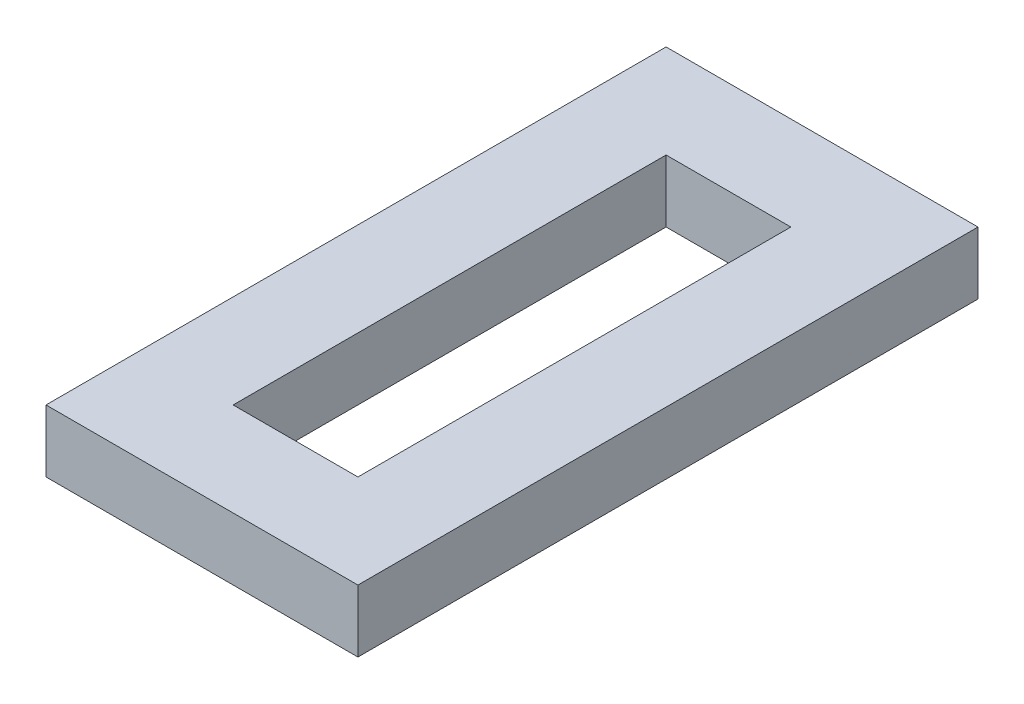
ISO-10303-21;
HEADER;
FILE_DESCRIPTION(('STEP AP214'),'2;1');
FILE_NAME('part.step','',(''),(''),'','','');
FILE_SCHEMA(('AUTOMOTIVE_DESIGN { 1 0 10303 214 1 1 1 1 }'));
ENDSEC;
DATA;
#1=APPLICATION_CONTEXT('core data for automotive mechanical design processes');
#2=APPLICATION_PROTOCOL_DEFINITION('international standard','automotive_design',2000,#1);
#3=PRODUCT_CONTEXT('',#1,'mechanical');
#4=PRODUCT('Part','Part','',(#3));
#5=PRODUCT_RELATED_PRODUCT_CATEGORY('part','',(#4));
#6=PRODUCT_DEFINITION_FORMATION('','',#4);
#7=PRODUCT_DEFINITION_CONTEXT('part definition',#1,'design');
#8=PRODUCT_DEFINITION('design','',#6,#7);
#9=PRODUCT_DEFINITION_SHAPE('','',#8);
#10=(LENGTH_UNIT() NAMED_UNIT(*) SI_UNIT(.MILLI.,.METRE.));
#11=(NAMED_UNIT(*) PLANE_ANGLE_UNIT() SI_UNIT($,.RADIAN.));
#12=(NAMED_UNIT(*) SI_UNIT($,.STERADIAN.) SOLID_ANGLE_UNIT());
#13=UNCERTAINTY_MEASURE_WITH_UNIT(LENGTH_MEASURE(1.E-05),#10,'distance_accuracy_value','');
#14=(GEOMETRIC_REPRESENTATION_CONTEXT(3) GLOBAL_UNCERTAINTY_ASSIGNED_CONTEXT((#13)) GLOBAL_UNIT_ASSIGNED_CONTEXT((#10,
#11,#12)) REPRESENTATION_CONTEXT('',''));
#15=CARTESIAN_POINT('',(0.,0.,0.));
#16=DIRECTION('',(0.,0.,1.));
#17=DIRECTION('',(1.,0.,0.));
#18=AXIS2_PLACEMENT_3D('',#15,#16,#17);
#19=CARTESIAN_POINT('',(25.,-10.,49.7));
#20=DIRECTION('',(1.,0.,0.));
#21=DIRECTION('',(0.,0.,-1.));
#22=AXIS2_PLACEMENT_3D('',#19,#20,#21);
#23=PLANE('',#22);
#24=DIRECTION('',(0.,0.,-1.));
#25=VECTOR('',#24,1.);
#26=CARTESIAN_POINT('',(25.,0.,49.7));
#27=LINE('',#26,#25);
#28=CARTESIAN_POINT('',(25.,0.,49.7));
#29=VERTEX_POINT('',#28);
#30=CARTESIAN_POINT('',(25.,0.,-49.7));
#31=VERTEX_POINT('',#30);
#32=EDGE_CURVE('E154',#29,#31,#27,.T.);
#33=ORIENTED_EDGE('',*,*,#32,.F.);
#34=DIRECTION('',(0.,1.,0.));
#35=VECTOR('',#34,1.);
#36=CARTESIAN_POINT('',(25.,-10.,49.7));
#37=LINE('',#36,#35);
#38=CARTESIAN_POINT('',(25.,-10.,49.7));
#39=VERTEX_POINT('',#38);
#40=EDGE_CURVE('E11',#39,#29,#37,.T.);
#41=ORIENTED_EDGE('',*,*,#40,.F.);
#42=DIRECTION('',(0.,0.,-1.));
#43=VECTOR('',#42,1.);
#44=CARTESIAN_POINT('',(25.,-10.,49.7));
#45=LINE('',#44,#43);
#46=CARTESIAN_POINT('',(25.,-10.,-49.7));
#47=VERTEX_POINT('',#46);
#48=EDGE_CURVE('E160',#39,#47,#45,.T.);
#49=ORIENTED_EDGE('',*,*,#48,.T.);
#50=DIRECTION('',(0.,1.,0.));
#51=VECTOR('',#50,1.);
#52=CARTESIAN_POINT('',(25.,-10.,-49.7));
#53=LINE('',#52,#51);
#54=EDGE_CURVE('E48',#47,#31,#53,.T.);
#55=ORIENTED_EDGE('',*,*,#54,.T.);
#56=EDGE_LOOP('',(#33,#41,#49,#55));
#57=FACE_BOUND('',#56,.T.);
#58=ADVANCED_FACE('F45',(#57),#23,.T.);
#59=CARTESIAN_POINT('',(-25.,-10.,49.7));
#60=DIRECTION('',(0.,0.,1.));
#61=DIRECTION('',(1.,0.,0.));
#62=AXIS2_PLACEMENT_3D('',#59,#60,#61);
#63=PLANE('',#62);
#64=DIRECTION('',(1.,0.,0.));
#65=VECTOR('',#64,1.);
#66=CARTESIAN_POINT('',(-25.,0.,49.7));
#67=LINE('',#66,#65);
#68=CARTESIAN_POINT('',(-25.,0.,49.7));
#69=VERTEX_POINT('',#68);
#70=EDGE_CURVE('E165',#69,#29,#67,.T.);
#71=ORIENTED_EDGE('',*,*,#70,.F.);
#72=DIRECTION('',(0.,1.,0.));
#73=VECTOR('',#72,1.);
#74=CARTESIAN_POINT('',(-25.,-10.,49.7));
#75=LINE('',#74,#73);
#76=CARTESIAN_POINT('',(-25.,-10.,49.7));
#77=VERTEX_POINT('',#76);
#78=EDGE_CURVE('E54',#77,#69,#75,.T.);
#79=ORIENTED_EDGE('',*,*,#78,.F.);
#80=DIRECTION('',(1.,0.,0.));
#81=VECTOR('',#80,1.);
#82=CARTESIAN_POINT('',(-25.,-10.,49.7));
#83=LINE('',#82,#81);
#84=EDGE_CURVE('E173',#77,#39,#83,.T.);
#85=ORIENTED_EDGE('',*,*,#84,.T.);
#86=ORIENTED_EDGE('',*,*,#40,.T.);
#87=EDGE_LOOP('',(#71,#79,#85,#86));
#88=FACE_BOUND('',#87,.T.);
#89=ADVANCED_FACE('F207',(#88),#63,.T.);
#90=CARTESIAN_POINT('',(-25.,-10.,49.7));
#91=DIRECTION('',(-1.,0.,0.));
#92=DIRECTION('',(0.,0.,1.));
#93=AXIS2_PLACEMENT_3D('',#90,#91,#92);
#94=PLANE('',#93);
#95=DIRECTION('',(0.,0.,1.));
#96=VECTOR('',#95,1.);
#97=CARTESIAN_POINT('',(-25.,0.,49.7));
#98=LINE('',#97,#96);
#99=CARTESIAN_POINT('',(-25.,0.,-49.7));
#100=VERTEX_POINT('',#99);
#101=EDGE_CURVE('E184',#100,#69,#98,.T.);
#102=ORIENTED_EDGE('',*,*,#101,.F.);
#103=DIRECTION('',(0.,1.,0.));
#104=VECTOR('',#103,1.);
#105=CARTESIAN_POINT('',(-25.,-10.,-49.7));
#106=LINE('',#105,#104);
#107=CARTESIAN_POINT('',(-25.,-10.,-49.7));
#108=VERTEX_POINT('',#107);
#109=EDGE_CURVE('E192',#108,#100,#106,.T.);
#110=ORIENTED_EDGE('',*,*,#109,.F.);
#111=DIRECTION('',(0.,0.,1.));
#112=VECTOR('',#111,1.);
#113=CARTESIAN_POINT('',(-25.,-10.,49.7));
#114=LINE('',#113,#112);
#115=EDGE_CURVE('E169',#108,#77,#114,.T.);
#116=ORIENTED_EDGE('',*,*,#115,.T.);
#117=ORIENTED_EDGE('',*,*,#78,.T.);
#118=EDGE_LOOP('',(#102,#110,#116,#117));
#119=FACE_BOUND('',#118,.T.);
#120=ADVANCED_FACE('F211',(#119),#94,.T.);
#121=CARTESIAN_POINT('',(-25.,-10.,-49.7));
#122=DIRECTION('',(0.,0.,-1.));
#123=DIRECTION('',(-1.,0.,0.));
#124=AXIS2_PLACEMENT_3D('',#121,#122,#123);
#125=PLANE('',#124);
#126=DIRECTION('',(-1.,0.,0.));
#127=VECTOR('',#126,1.);
#128=CARTESIAN_POINT('',(-25.,0.,-49.7));
#129=LINE('',#128,#127);
#130=EDGE_CURVE('E180',#31,#100,#129,.T.);
#131=ORIENTED_EDGE('',*,*,#130,.F.);
#132=ORIENTED_EDGE('',*,*,#54,.F.);
#133=DIRECTION('',(-1.,0.,0.));
#134=VECTOR('',#133,1.);
#135=CARTESIAN_POINT('',(-25.,-10.,-49.7));
#136=LINE('',#135,#134);
#137=EDGE_CURVE('E164',#47,#108,#136,.T.);
#138=ORIENTED_EDGE('',*,*,#137,.T.);
#139=ORIENTED_EDGE('',*,*,#109,.T.);
#140=EDGE_LOOP('',(#131,#132,#138,#139));
#141=FACE_BOUND('',#140,.T.);
#142=ADVANCED_FACE('F202',(#141),#125,.T.);
#143=CARTESIAN_POINT('',(0.,-10.,0.));
#144=DIRECTION('',(0.,-1.,0.));
#145=DIRECTION('',(0.,0.,-1.));
#146=AXIS2_PLACEMENT_3D('',#143,#144,#145);
#147=PLANE('',#146);
#148=DIRECTION('',(0.,0.,1.));
#149=VECTOR('',#148,1.);
#150=CARTESIAN_POINT('',(-10.,-10.,34.7));
#151=LINE('',#150,#149);
#152=CARTESIAN_POINT('',(-10.,-10.,-34.7));
#153=VERTEX_POINT('',#152);
#154=CARTESIAN_POINT('',(-10.,-10.,34.7));
#155=VERTEX_POINT('',#154);
#156=EDGE_CURVE('E113',#153,#155,#151,.T.);
#157=ORIENTED_EDGE('',*,*,#156,.T.);
#158=DIRECTION('',(1.,0.,0.));
#159=VECTOR('',#158,1.);
#160=CARTESIAN_POINT('',(-10.,-10.,34.7));
#161=LINE('',#160,#159);
#162=CARTESIAN_POINT('',(10.,-10.,34.7));
#163=VERTEX_POINT('',#162);
#164=EDGE_CURVE('E123',#155,#163,#161,.T.);
#165=ORIENTED_EDGE('',*,*,#164,.T.);
#166=DIRECTION('',(0.,0.,-1.));
#167=VECTOR('',#166,1.);
#168=CARTESIAN_POINT('',(10.,-10.,34.7));
#169=LINE('',#168,#167);
#170=CARTESIAN_POINT('',(10.,-10.,-34.7));
#171=VERTEX_POINT('',#170);
#172=EDGE_CURVE('E62',#163,#171,#169,.T.);
#173=ORIENTED_EDGE('',*,*,#172,.T.);
#174=DIRECTION('',(-1.,0.,0.));
#175=VECTOR('',#174,1.);
#176=CARTESIAN_POINT('',(-10.,-10.,-34.7));
#177=LINE('',#176,#175);
#178=EDGE_CURVE('E120',#171,#153,#177,.T.);
#179=ORIENTED_EDGE('',*,*,#178,.T.);
#180=EDGE_LOOP('',(#157,#165,#173,#179));
#181=FACE_BOUND('',#180,.T.);
#182=ORIENTED_EDGE('',*,*,#48,.F.);
#183=ORIENTED_EDGE('',*,*,#84,.F.);
#184=ORIENTED_EDGE('',*,*,#115,.F.);
#185=ORIENTED_EDGE('',*,*,#137,.F.);
#186=EDGE_LOOP('',(#182,#183,#184,#185));
#187=FACE_BOUND('',#186,.T.);
#188=ADVANCED_FACE('F128',(#181,#187),#147,.T.);
#189=CARTESIAN_POINT('',(0.,0.,0.));
#190=DIRECTION('',(0.,-1.,0.));
#191=DIRECTION('',(0.,0.,-1.));
#192=AXIS2_PLACEMENT_3D('',#189,#190,#191);
#193=PLANE('',#192);
#194=DIRECTION('',(1.,0.,0.));
#195=VECTOR('',#194,1.);
#196=CARTESIAN_POINT('',(-10.,0.,34.7));
#197=LINE('',#196,#195);
#198=CARTESIAN_POINT('',(-10.,0.,34.7));
#199=VERTEX_POINT('',#198);
#200=CARTESIAN_POINT('',(10.,0.,34.7));
#201=VERTEX_POINT('',#200);
#202=EDGE_CURVE('E145',#199,#201,#197,.T.);
#203=ORIENTED_EDGE('',*,*,#202,.F.);
#204=DIRECTION('',(0.,0.,1.));
#205=VECTOR('',#204,1.);
#206=CARTESIAN_POINT('',(-10.,0.,34.7));
#207=LINE('',#206,#205);
#208=CARTESIAN_POINT('',(-10.,0.,-34.7));
#209=VERTEX_POINT('',#208);
#210=EDGE_CURVE('E70',#209,#199,#207,.T.);
#211=ORIENTED_EDGE('',*,*,#210,.F.);
#212=DIRECTION('',(-1.,0.,0.));
#213=VECTOR('',#212,1.);
#214=CARTESIAN_POINT('',(-10.,0.,-34.7));
#215=LINE('',#214,#213);
#216=CARTESIAN_POINT('',(10.,0.,-34.7));
#217=VERTEX_POINT('',#216);
#218=EDGE_CURVE('E132',#217,#209,#215,.T.);
#219=ORIENTED_EDGE('',*,*,#218,.F.);
#220=DIRECTION('',(0.,0.,-1.));
#221=VECTOR('',#220,1.);
#222=CARTESIAN_POINT('',(10.,0.,34.7));
#223=LINE('',#222,#221);
#224=EDGE_CURVE('E136',#201,#217,#223,.T.);
#225=ORIENTED_EDGE('',*,*,#224,.F.);
#226=EDGE_LOOP('',(#203,#211,#219,#225));
#227=FACE_BOUND('',#226,.T.);
#228=ORIENTED_EDGE('',*,*,#32,.T.);
#229=ORIENTED_EDGE('',*,*,#130,.T.);
#230=ORIENTED_EDGE('',*,*,#101,.T.);
#231=ORIENTED_EDGE('',*,*,#70,.T.);
#232=EDGE_LOOP('',(#228,#229,#230,#231));
#233=FACE_BOUND('',#232,.T.);
#234=ADVANCED_FACE('F204',(#227,#233),#193,.F.);
#235=CARTESIAN_POINT('',(-10.,-10.,34.7));
#236=DIRECTION('',(-1.,0.,0.));
#237=DIRECTION('',(0.,0.,1.));
#238=AXIS2_PLACEMENT_3D('',#235,#236,#237);
#239=PLANE('',#238);
#240=ORIENTED_EDGE('',*,*,#210,.T.);
#241=DIRECTION('',(0.,1.,0.));
#242=VECTOR('',#241,1.);
#243=CARTESIAN_POINT('',(-10.,-10.,34.7));
#244=LINE('',#243,#242);
#245=EDGE_CURVE('E109',#155,#199,#244,.T.);
#246=ORIENTED_EDGE('',*,*,#245,.F.);
#247=ORIENTED_EDGE('',*,*,#156,.F.);
#248=DIRECTION('',(0.,1.,0.));
#249=VECTOR('',#248,1.);
#250=CARTESIAN_POINT('',(-10.,-10.,-34.7));
#251=LINE('',#250,#249);
#252=EDGE_CURVE('E151',#153,#209,#251,.T.);
#253=ORIENTED_EDGE('',*,*,#252,.T.);
#254=EDGE_LOOP('',(#240,#246,#247,#253));
#255=FACE_BOUND('',#254,.T.);
#256=ADVANCED_FACE('F111',(#255),#239,.F.);
#257=CARTESIAN_POINT('',(-10.,-10.,-34.7));
#258=DIRECTION('',(0.,0.,-1.));
#259=DIRECTION('',(-1.,0.,0.));
#260=AXIS2_PLACEMENT_3D('',#257,#258,#259);
#261=PLANE('',#260);
#262=ORIENTED_EDGE('',*,*,#218,.T.);
#263=ORIENTED_EDGE('',*,*,#252,.F.);
#264=ORIENTED_EDGE('',*,*,#178,.F.);
#265=DIRECTION('',(0.,1.,0.));
#266=VECTOR('',#265,1.);
#267=CARTESIAN_POINT('',(10.,-10.,-34.7));
#268=LINE('',#267,#266);
#269=EDGE_CURVE('E155',#171,#217,#268,.T.);
#270=ORIENTED_EDGE('',*,*,#269,.T.);
#271=EDGE_LOOP('',(#262,#263,#264,#270));
#272=FACE_BOUND('',#271,.T.);
#273=ADVANCED_FACE('F264',(#272),#261,.F.);
#274=CARTESIAN_POINT('',(10.,-10.,34.7));
#275=DIRECTION('',(1.,0.,0.));
#276=DIRECTION('',(0.,0.,-1.));
#277=AXIS2_PLACEMENT_3D('',#274,#275,#276);
#278=PLANE('',#277);
#279=ORIENTED_EDGE('',*,*,#224,.T.);
#280=ORIENTED_EDGE('',*,*,#269,.F.);
#281=ORIENTED_EDGE('',*,*,#172,.F.);
#282=DIRECTION('',(0.,1.,0.));
#283=VECTOR('',#282,1.);
#284=CARTESIAN_POINT('',(10.,-10.,34.7));
#285=LINE('',#284,#283);
#286=EDGE_CURVE('E119',#163,#201,#285,.T.);
#287=ORIENTED_EDGE('',*,*,#286,.T.);
#288=EDGE_LOOP('',(#279,#280,#281,#287));
#289=FACE_BOUND('',#288,.T.);
#290=ADVANCED_FACE('F273',(#289),#278,.F.);
#291=CARTESIAN_POINT('',(-10.,-10.,34.7));
#292=DIRECTION('',(0.,0.,1.));
#293=DIRECTION('',(1.,0.,0.));
#294=AXIS2_PLACEMENT_3D('',#291,#292,#293);
#295=PLANE('',#294);
#296=ORIENTED_EDGE('',*,*,#202,.T.);
#297=ORIENTED_EDGE('',*,*,#286,.F.);
#298=ORIENTED_EDGE('',*,*,#164,.F.);
#299=ORIENTED_EDGE('',*,*,#245,.T.);
#300=EDGE_LOOP('',(#296,#297,#298,#299));
#301=FACE_BOUND('',#300,.T.);
#302=ADVANCED_FACE('F124',(#301),#295,.F.);
#303=CLOSED_SHELL('',(#58,#89,#120,#142,#188,#234,#256,#273,#290,#302));
#304=MANIFOLD_SOLID_BREP('B2',#303);
#305=ADVANCED_BREP_SHAPE_REPRESENTATION('',(#18,#304),#14);
#306=SHAPE_DEFINITION_REPRESENTATION(#9,#305);
ENDSEC;
END-ISO-10303-21;
